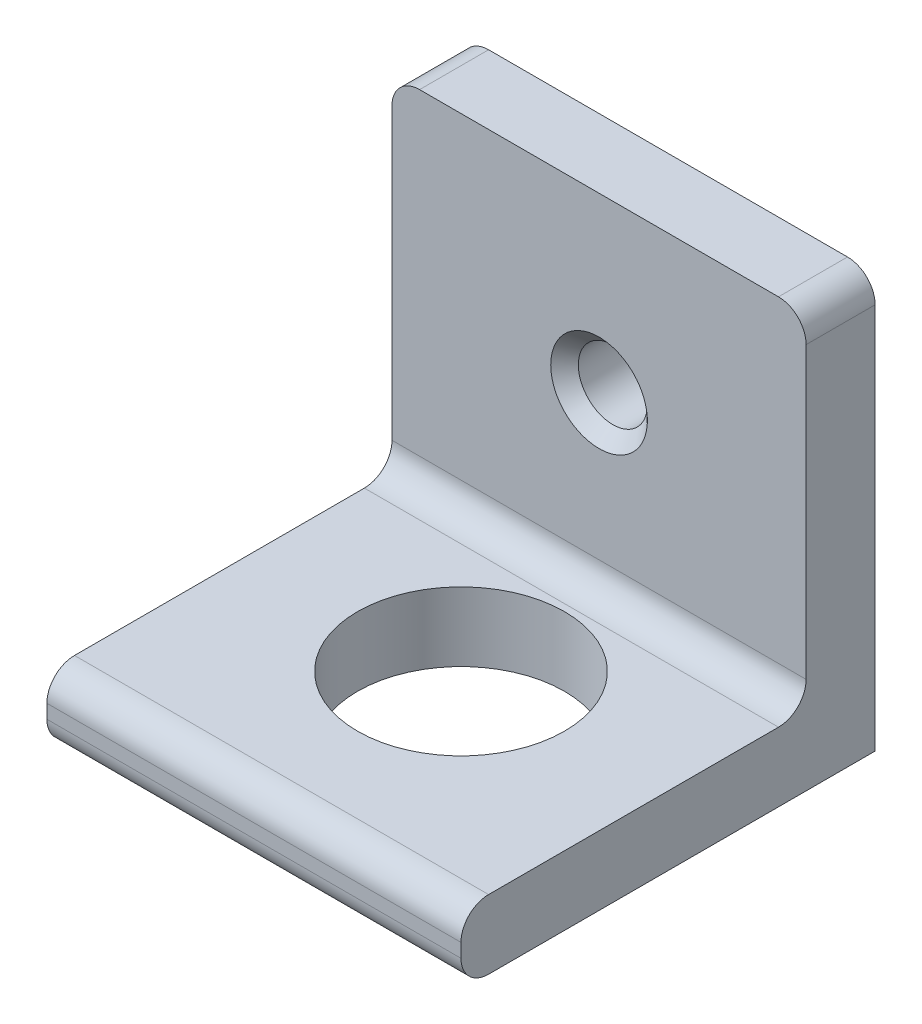
ISO-10303-21;
HEADER;
FILE_DESCRIPTION(('STEP AP214'),'2;1');
FILE_NAME('part.step','',(''),(''),'','','');
FILE_SCHEMA(('AUTOMOTIVE_DESIGN { 1 0 10303 214 1 1 1 1 }'));
ENDSEC;
DATA;
#1=APPLICATION_CONTEXT('core data for automotive mechanical design processes');
#2=APPLICATION_PROTOCOL_DEFINITION('international standard','automotive_design',2000,#1);
#3=PRODUCT_CONTEXT('',#1,'mechanical');
#4=PRODUCT('Part','Part','',(#3));
#5=PRODUCT_RELATED_PRODUCT_CATEGORY('part','',(#4));
#6=PRODUCT_DEFINITION_FORMATION('','',#4);
#7=PRODUCT_DEFINITION_CONTEXT('part definition',#1,'design');
#8=PRODUCT_DEFINITION('design','',#6,#7);
#9=PRODUCT_DEFINITION_SHAPE('','',#8);
#10=(LENGTH_UNIT() NAMED_UNIT(*) SI_UNIT(.MILLI.,.METRE.));
#11=(NAMED_UNIT(*) PLANE_ANGLE_UNIT() SI_UNIT($,.RADIAN.));
#12=(NAMED_UNIT(*) SI_UNIT($,.STERADIAN.) SOLID_ANGLE_UNIT());
#13=UNCERTAINTY_MEASURE_WITH_UNIT(LENGTH_MEASURE(1.E-05),#10,'distance_accuracy_value','');
#14=(GEOMETRIC_REPRESENTATION_CONTEXT(3) GLOBAL_UNCERTAINTY_ASSIGNED_CONTEXT((#13)) GLOBAL_UNIT_ASSIGNED_CONTEXT((#10,
#11,#12)) REPRESENTATION_CONTEXT('',''));
#15=CARTESIAN_POINT('',(0.,0.,0.));
#16=DIRECTION('',(0.,0.,1.));
#17=DIRECTION('',(1.,0.,0.));
#18=AXIS2_PLACEMENT_3D('',#15,#16,#17);
#19=CARTESIAN_POINT('',(0.,5.,0.));
#20=DIRECTION('',(0.,-1.,0.));
#21=DIRECTION('',(0.,0.,-1.));
#22=AXIS2_PLACEMENT_3D('',#19,#20,#21);
#23=PLANE('',#22);
#24=CARTESIAN_POINT('',(82.3088028635692,5.,0.815715524096896));
#25=DIRECTION('',(0.,1.,0.));
#26=DIRECTION('',(0.,0.,-1.));
#27=AXIS2_PLACEMENT_3D('',#24,#25,#26);
#28=CIRCLE('',#27,7.50000000000001);
#29=CARTESIAN_POINT('',(82.3088028635692,5.,-6.68428447590312));
#30=VERTEX_POINT('',#29);
#31=EDGE_CURVE('E163',#30,#30,#28,.T.);
#32=ORIENTED_EDGE('',*,*,#31,.F.);
#33=EDGE_LOOP('',(#32));
#34=FACE_BOUND('',#33,.T.);
#35=DIRECTION('',(0.,0.,-1.));
#36=VECTOR('',#35,1.);
#37=CARTESIAN_POINT('',(67.3088028635692,5.,0.));
#38=LINE('',#37,#36);
#39=CARTESIAN_POINT('',(67.3088028635692,5.,13.8157155240969));
#40=VERTEX_POINT('',#39);
#41=CARTESIAN_POINT('',(67.3088028635692,5.,-7.18428447590311));
#42=VERTEX_POINT('',#41);
#43=EDGE_CURVE('E117',#40,#42,#38,.T.);
#44=ORIENTED_EDGE('',*,*,#43,.F.);
#45=DIRECTION('',(1.,0.,0.));
#46=VECTOR('',#45,1.);
#47=CARTESIAN_POINT('',(0.,5.,13.8157155240969));
#48=LINE('',#47,#46);
#49=CARTESIAN_POINT('',(97.3088028635692,5.,13.8157155240969));
#50=VERTEX_POINT('',#49);
#51=EDGE_CURVE('E183',#40,#50,#48,.T.);
#52=ORIENTED_EDGE('',*,*,#51,.T.);
#53=DIRECTION('',(0.,0.,-1.));
#54=VECTOR('',#53,1.);
#55=CARTESIAN_POINT('',(97.3088028635692,5.,15.8157155240969));
#56=LINE('',#55,#54);
#57=CARTESIAN_POINT('',(97.3088028635692,5.,-7.18428447590311));
#58=VERTEX_POINT('',#57);
#59=EDGE_CURVE('E173',#50,#58,#56,.T.);
#60=ORIENTED_EDGE('',*,*,#59,.T.);
#61=DIRECTION('',(1.,0.,0.));
#62=VECTOR('',#61,1.);
#63=CARTESIAN_POINT('',(-52.6911971364308,5.,-7.1842844759031));
#64=LINE('',#63,#62);
#65=EDGE_CURVE('E181',#58,#42,#64,.F.);
#66=ORIENTED_EDGE('',*,*,#65,.T.);
#67=EDGE_LOOP('',(#44,#52,#60,#66));
#68=FACE_BOUND('',#67,.T.);
#69=ADVANCED_FACE('F33',(#34,#68),#23,.F.);
#70=CARTESIAN_POINT('',(-52.6911971364308,5.,15.8157155240969));
#71=DIRECTION('',(0.,0.,-1.));
#72=DIRECTION('',(-1.,0.,0.));
#73=AXIS2_PLACEMENT_3D('',#70,#71,#72);
#74=PLANE('',#73);
#75=DIRECTION('',(0.,1.,0.));
#76=VECTOR('',#75,1.);
#77=CARTESIAN_POINT('',(67.3088028635692,5.,15.8157155240969));
#78=LINE('',#77,#76);
#79=CARTESIAN_POINT('',(67.3088028635692,2.,15.8157155240969));
#80=VERTEX_POINT('',#79);
#81=CARTESIAN_POINT('',(67.3088028635692,3.,15.8157155240969));
#82=VERTEX_POINT('',#81);
#83=EDGE_CURVE('E223',#80,#82,#78,.T.);
#84=ORIENTED_EDGE('',*,*,#83,.F.);
#85=DIRECTION('',(1.,0.,0.));
#86=VECTOR('',#85,1.);
#87=CARTESIAN_POINT('',(97.3088028635692,2.,15.8157155240969));
#88=LINE('',#87,#86);
#89=CARTESIAN_POINT('',(97.3088028635692,2.,15.8157155240969));
#90=VERTEX_POINT('',#89);
#91=EDGE_CURVE('E243',#80,#90,#88,.T.);
#92=ORIENTED_EDGE('',*,*,#91,.T.);
#93=DIRECTION('',(0.,-1.,0.));
#94=VECTOR('',#93,1.);
#95=CARTESIAN_POINT('',(97.3088028635692,5.,15.8157155240969));
#96=LINE('',#95,#94);
#97=CARTESIAN_POINT('',(97.3088028635692,3.,15.8157155240969));
#98=VERTEX_POINT('',#97);
#99=EDGE_CURVE('E191',#98,#90,#96,.T.);
#100=ORIENTED_EDGE('',*,*,#99,.F.);
#101=DIRECTION('',(1.,0.,0.));
#102=VECTOR('',#101,1.);
#103=CARTESIAN_POINT('',(-52.6911971364308,3.,15.8157155240969));
#104=LINE('',#103,#102);
#105=EDGE_CURVE('E238',#98,#82,#104,.F.);
#106=ORIENTED_EDGE('',*,*,#105,.T.);
#107=EDGE_LOOP('',(#84,#92,#100,#106));
#108=FACE_BOUND('',#107,.T.);
#109=ADVANCED_FACE('F241',(#108),#74,.F.);
#110=CARTESIAN_POINT('',(-52.6911971364308,5.,-14.1842844759031));
#111=DIRECTION('',(0.,0.,1.));
#112=DIRECTION('',(1.,0.,0.));
#113=AXIS2_PLACEMENT_3D('',#110,#111,#112);
#114=PLANE('',#113);
#115=CARTESIAN_POINT('',(82.3088028635692,17.4786642448446,-14.1842844759031));
#116=DIRECTION('',(0.,0.,1.));
#117=DIRECTION('',(1.,0.,0.));
#118=AXIS2_PLACEMENT_3D('',#115,#116,#117);
#119=CIRCLE('',#118,2.50000000000001);
#120=CARTESIAN_POINT('',(84.8088028635692,17.4786642448446,-14.1842844759031));
#121=VERTEX_POINT('',#120);
#122=EDGE_CURVE('E219',#121,#121,#119,.T.);
#123=ORIENTED_EDGE('',*,*,#122,.T.);
#124=EDGE_LOOP('',(#123));
#125=FACE_BOUND('',#124,.T.);
#126=DIRECTION('',(0.,-1.,0.));
#127=VECTOR('',#126,1.);
#128=CARTESIAN_POINT('',(67.3088028635692,5.,-14.1842844759031));
#129=LINE('',#128,#127);
#130=CARTESIAN_POINT('',(67.3088028635692,28.,-14.1842844759031));
#131=VERTEX_POINT('',#130);
#132=CARTESIAN_POINT('',(67.3088028635692,0.,-14.1842844759031));
#133=VERTEX_POINT('',#132);
#134=EDGE_CURVE('E227',#131,#133,#129,.T.);
#135=ORIENTED_EDGE('',*,*,#134,.F.);
#136=CARTESIAN_POINT('',(69.3088028635692,28.,-14.1842844759031));
#137=DIRECTION('',(0.,0.,1.));
#138=DIRECTION('',(1.,0.,0.));
#139=AXIS2_PLACEMENT_3D('',#136,#137,#138);
#140=CIRCLE('',#139,2.);
#141=CARTESIAN_POINT('',(69.3088028635692,30.,-14.1842844759031));
#142=VERTEX_POINT('',#141);
#143=EDGE_CURVE('E11',#131,#142,#140,.F.);
#144=ORIENTED_EDGE('',*,*,#143,.T.);
#145=DIRECTION('',(-1.,0.,0.));
#146=VECTOR('',#145,1.);
#147=CARTESIAN_POINT('',(-52.6911971364308,30.,-14.1842844759031));
#148=LINE('',#147,#146);
#149=CARTESIAN_POINT('',(95.3088028635692,30.,-14.1842844759031));
#150=VERTEX_POINT('',#149);
#151=EDGE_CURVE('E153',#150,#142,#148,.T.);
#152=ORIENTED_EDGE('',*,*,#151,.F.);
#153=CARTESIAN_POINT('',(95.3088028635692,28.,-14.1842844759031));
#154=DIRECTION('',(0.,0.,1.));
#155=DIRECTION('',(1.,0.,0.));
#156=AXIS2_PLACEMENT_3D('',#153,#154,#155);
#157=CIRCLE('',#156,2.);
#158=CARTESIAN_POINT('',(97.3088028635692,28.,-14.1842844759031));
#159=VERTEX_POINT('',#158);
#160=EDGE_CURVE('E136',#150,#159,#157,.F.);
#161=ORIENTED_EDGE('',*,*,#160,.T.);
#162=DIRECTION('',(0.,-1.,0.));
#163=VECTOR('',#162,1.);
#164=CARTESIAN_POINT('',(97.3088028635692,5.,-14.1842844759031));
#165=LINE('',#164,#163);
#166=CARTESIAN_POINT('',(97.3088028635692,0.,-14.1842844759031));
#167=VERTEX_POINT('',#166);
#168=EDGE_CURVE('E177',#159,#167,#165,.T.);
#169=ORIENTED_EDGE('',*,*,#168,.T.);
#170=DIRECTION('',(-1.,0.,0.));
#171=VECTOR('',#170,1.);
#172=CARTESIAN_POINT('',(-52.6911971364308,0.,-14.1842844759031));
#173=LINE('',#172,#171);
#174=EDGE_CURVE('E178',#167,#133,#173,.T.);
#175=ORIENTED_EDGE('',*,*,#174,.T.);
#176=EDGE_LOOP('',(#135,#144,#152,#161,#169,#175));
#177=FACE_BOUND('',#176,.T.);
#178=ADVANCED_FACE('F250',(#125,#177),#114,.F.);
#179=CARTESIAN_POINT('',(0.,0.,0.));
#180=DIRECTION('',(0.,-1.,0.));
#181=DIRECTION('',(0.,0.,-1.));
#182=AXIS2_PLACEMENT_3D('',#179,#180,#181);
#183=PLANE('',#182);
#184=CARTESIAN_POINT('',(82.3088028635692,0.,0.815715524096896));
#185=DIRECTION('',(0.,-1.,0.));
#186=DIRECTION('',(0.,0.,-1.));
#187=AXIS2_PLACEMENT_3D('',#184,#185,#186);
#188=CIRCLE('',#187,7.50000000000001);
#189=CARTESIAN_POINT('',(82.3088028635692,0.,-6.68428447590312));
#190=VERTEX_POINT('',#189);
#191=EDGE_CURVE('E158',#190,#190,#188,.T.);
#192=ORIENTED_EDGE('',*,*,#191,.F.);
#193=EDGE_LOOP('',(#192));
#194=FACE_BOUND('',#193,.T.);
#195=DIRECTION('',(1.,0.,0.));
#196=VECTOR('',#195,1.);
#197=CARTESIAN_POINT('',(-52.6911971364308,0.,13.8157155240969));
#198=LINE('',#197,#196);
#199=CARTESIAN_POINT('',(97.3088028635692,0.,13.8157155240969));
#200=VERTEX_POINT('',#199);
#201=CARTESIAN_POINT('',(67.3088028635692,0.,13.8157155240969));
#202=VERTEX_POINT('',#201);
#203=EDGE_CURVE('E139',#200,#202,#198,.F.);
#204=ORIENTED_EDGE('',*,*,#203,.T.);
#205=DIRECTION('',(0.,0.,-1.));
#206=VECTOR('',#205,1.);
#207=CARTESIAN_POINT('',(67.3088028635692,0.,0.));
#208=LINE('',#207,#206);
#209=EDGE_CURVE('E217',#202,#133,#208,.T.);
#210=ORIENTED_EDGE('',*,*,#209,.T.);
#211=ORIENTED_EDGE('',*,*,#174,.F.);
#212=DIRECTION('',(0.,0.,-1.));
#213=VECTOR('',#212,1.);
#214=CARTESIAN_POINT('',(97.3088028635692,0.,15.8157155240969));
#215=LINE('',#214,#213);
#216=EDGE_CURVE('E170',#200,#167,#215,.T.);
#217=ORIENTED_EDGE('',*,*,#216,.F.);
#218=EDGE_LOOP('',(#204,#210,#211,#217));
#219=FACE_BOUND('',#218,.T.);
#220=ADVANCED_FACE('F216',(#194,#219),#183,.T.);
#221=CARTESIAN_POINT('',(-52.6911971364308,30.,-9.1842844759031));
#222=DIRECTION('',(0.,0.,-1.));
#223=DIRECTION('',(-1.,0.,0.));
#224=AXIS2_PLACEMENT_3D('',#221,#222,#223);
#225=PLANE('',#224);
#226=CARTESIAN_POINT('',(82.3088028635692,17.4786642448446,-9.18428447590311));
#227=DIRECTION('',(0.,0.,-1.));
#228=DIRECTION('',(-1.,0.,0.));
#229=AXIS2_PLACEMENT_3D('',#226,#227,#228);
#230=CIRCLE('',#229,3.50000000000006);
#231=CARTESIAN_POINT('',(78.8088028635691,17.4786642448446,-9.18428447590311));
#232=VERTEX_POINT('',#231);
#233=EDGE_CURVE('E193',#232,#232,#230,.T.);
#234=ORIENTED_EDGE('',*,*,#233,.T.);
#235=EDGE_LOOP('',(#234));
#236=FACE_BOUND('',#235,.T.);
#237=DIRECTION('',(1.,0.,0.));
#238=VECTOR('',#237,1.);
#239=CARTESIAN_POINT('',(-52.6911971364308,30.,-9.1842844759031));
#240=LINE('',#239,#238);
#241=CARTESIAN_POINT('',(69.3088028635692,30.,-9.18428447590311));
#242=VERTEX_POINT('',#241);
#243=CARTESIAN_POINT('',(95.3088028635692,30.,-9.18428447590311));
#244=VERTEX_POINT('',#243);
#245=EDGE_CURVE('E151',#242,#244,#240,.T.);
#246=ORIENTED_EDGE('',*,*,#245,.F.);
#247=CARTESIAN_POINT('',(69.3088028635692,28.,-9.18428447590311));
#248=DIRECTION('',(0.,0.,-1.));
#249=DIRECTION('',(-1.,0.,0.));
#250=AXIS2_PLACEMENT_3D('',#247,#248,#249);
#251=CIRCLE('',#250,2.);
#252=CARTESIAN_POINT('',(67.3088028635692,28.,-9.18428447590311));
#253=VERTEX_POINT('',#252);
#254=EDGE_CURVE('E55',#242,#253,#251,.F.);
#255=ORIENTED_EDGE('',*,*,#254,.T.);
#256=DIRECTION('',(0.,1.,0.));
#257=VECTOR('',#256,1.);
#258=CARTESIAN_POINT('',(67.3088028635692,30.,-9.18428447590311));
#259=LINE('',#258,#257);
#260=CARTESIAN_POINT('',(67.3088028635692,7.,-9.18428447590311));
#261=VERTEX_POINT('',#260);
#262=EDGE_CURVE('E115',#261,#253,#259,.T.);
#263=ORIENTED_EDGE('',*,*,#262,.F.);
#264=DIRECTION('',(1.,0.,0.));
#265=VECTOR('',#264,1.);
#266=CARTESIAN_POINT('',(97.3088028635692,7.,-9.18428447590311));
#267=LINE('',#266,#265);
#268=CARTESIAN_POINT('',(97.3088028635692,7.,-9.18428447590311));
#269=VERTEX_POINT('',#268);
#270=EDGE_CURVE('E127',#261,#269,#267,.T.);
#271=ORIENTED_EDGE('',*,*,#270,.T.);
#272=DIRECTION('',(0.,-1.,0.));
#273=VECTOR('',#272,1.);
#274=CARTESIAN_POINT('',(97.3088028635692,30.,-9.18428447590311));
#275=LINE('',#274,#273);
#276=CARTESIAN_POINT('',(97.3088028635692,28.,-9.18428447590311));
#277=VERTEX_POINT('',#276);
#278=EDGE_CURVE('E160',#277,#269,#275,.T.);
#279=ORIENTED_EDGE('',*,*,#278,.F.);
#280=CARTESIAN_POINT('',(95.3088028635692,28.,-9.18428447590311));
#281=DIRECTION('',(0.,0.,-1.));
#282=DIRECTION('',(-1.,0.,0.));
#283=AXIS2_PLACEMENT_3D('',#280,#281,#282);
#284=CIRCLE('',#283,2.);
#285=EDGE_CURVE('E133',#277,#244,#284,.F.);
#286=ORIENTED_EDGE('',*,*,#285,.T.);
#287=EDGE_LOOP('',(#246,#255,#263,#271,#279,#286));
#288=FACE_BOUND('',#287,.T.);
#289=ADVANCED_FACE('F125',(#236,#288),#225,.F.);
#290=CARTESIAN_POINT('',(0.,30.,0.));
#291=DIRECTION('',(0.,1.,0.));
#292=DIRECTION('',(0.,0.,1.));
#293=AXIS2_PLACEMENT_3D('',#290,#291,#292);
#294=PLANE('',#293);
#295=ORIENTED_EDGE('',*,*,#151,.T.);
#296=DIRECTION('',(0.,0.,1.));
#297=VECTOR('',#296,1.);
#298=CARTESIAN_POINT('',(69.3088028635692,30.,0.));
#299=LINE('',#298,#297);
#300=EDGE_CURVE('E122',#142,#242,#299,.T.);
#301=ORIENTED_EDGE('',*,*,#300,.T.);
#302=ORIENTED_EDGE('',*,*,#245,.T.);
#303=DIRECTION('',(0.,0.,-1.));
#304=VECTOR('',#303,1.);
#305=CARTESIAN_POINT('',(95.3088028635692,30.,-14.1842844759031));
#306=LINE('',#305,#304);
#307=EDGE_CURVE('E132',#244,#150,#306,.T.);
#308=ORIENTED_EDGE('',*,*,#307,.T.);
#309=EDGE_LOOP('',(#295,#301,#302,#308));
#310=FACE_BOUND('',#309,.T.);
#311=ADVANCED_FACE('F150',(#310),#294,.T.);
#312=CARTESIAN_POINT('',(0.,3.,13.8157155240969));
#313=DIRECTION('',(1.,0.,0.));
#314=DIRECTION('',(0.,0.,-1.));
#315=AXIS2_PLACEMENT_3D('',#312,#313,#314);
#316=CYLINDRICAL_SURFACE('',#315,2.);
#317=ORIENTED_EDGE('',*,*,#51,.F.);
#318=CARTESIAN_POINT('',(67.3088028635692,3.,13.8157155240969));
#319=DIRECTION('',(-1.,0.,0.));
#320=DIRECTION('',(0.,0.,1.));
#321=AXIS2_PLACEMENT_3D('',#318,#319,#320);
#322=CIRCLE('',#321,2.);
#323=EDGE_CURVE('E229',#40,#82,#322,.F.);
#324=ORIENTED_EDGE('',*,*,#323,.T.);
#325=ORIENTED_EDGE('',*,*,#105,.F.);
#326=CARTESIAN_POINT('',(97.3088028635692,3.,13.8157155240969));
#327=DIRECTION('',(-1.,0.,0.));
#328=DIRECTION('',(0.,0.,1.));
#329=AXIS2_PLACEMENT_3D('',#326,#327,#328);
#330=CIRCLE('',#329,2.);
#331=EDGE_CURVE('E245',#50,#98,#330,.F.);
#332=ORIENTED_EDGE('',*,*,#331,.F.);
#333=EDGE_LOOP('',(#317,#324,#325,#332));
#334=FACE_BOUND('',#333,.T.);
#335=ADVANCED_FACE('F236',(#334),#316,.T.);
#336=CARTESIAN_POINT('',(-52.6911971364308,2.,13.8157155240969));
#337=DIRECTION('',(-1.,0.,0.));
#338=DIRECTION('',(0.,0.,1.));
#339=AXIS2_PLACEMENT_3D('',#336,#337,#338);
#340=CYLINDRICAL_SURFACE('',#339,2.);
#341=ORIENTED_EDGE('',*,*,#91,.F.);
#342=CARTESIAN_POINT('',(67.3088028635692,2.,13.8157155240969));
#343=DIRECTION('',(-1.,0.,0.));
#344=DIRECTION('',(0.,0.,1.));
#345=AXIS2_PLACEMENT_3D('',#342,#343,#344);
#346=CIRCLE('',#345,2.);
#347=EDGE_CURVE('E220',#80,#202,#346,.F.);
#348=ORIENTED_EDGE('',*,*,#347,.T.);
#349=ORIENTED_EDGE('',*,*,#203,.F.);
#350=CARTESIAN_POINT('',(97.3088028635692,2.,13.8157155240969));
#351=DIRECTION('',(-1.,0.,0.));
#352=DIRECTION('',(0.,0.,1.));
#353=AXIS2_PLACEMENT_3D('',#350,#351,#352);
#354=CIRCLE('',#353,2.);
#355=EDGE_CURVE('E211',#90,#200,#354,.F.);
#356=ORIENTED_EDGE('',*,*,#355,.F.);
#357=EDGE_LOOP('',(#341,#348,#349,#356));
#358=FACE_BOUND('',#357,.T.);
#359=ADVANCED_FACE('F284',(#358),#340,.T.);
#360=CARTESIAN_POINT('',(-52.6911971364308,7.,-7.1842844759031));
#361=DIRECTION('',(-1.,0.,0.));
#362=DIRECTION('',(0.,0.,1.));
#363=AXIS2_PLACEMENT_3D('',#360,#361,#362);
#364=CYLINDRICAL_SURFACE('',#363,2.);
#365=CARTESIAN_POINT('',(67.3088028635692,7.,-7.18428447590311));
#366=DIRECTION('',(-1.,0.,0.));
#367=DIRECTION('',(0.,0.,1.));
#368=AXIS2_PLACEMENT_3D('',#365,#366,#367);
#369=CIRCLE('',#368,2.);
#370=EDGE_CURVE('E113',#42,#261,#369,.F.);
#371=ORIENTED_EDGE('',*,*,#370,.F.);
#372=ORIENTED_EDGE('',*,*,#65,.F.);
#373=CARTESIAN_POINT('',(97.3088028635692,7.,-7.18428447590311));
#374=DIRECTION('',(-1.,0.,0.));
#375=DIRECTION('',(0.,0.,1.));
#376=AXIS2_PLACEMENT_3D('',#373,#374,#375);
#377=CIRCLE('',#376,2.);
#378=EDGE_CURVE('E123',#269,#58,#377,.T.);
#379=ORIENTED_EDGE('',*,*,#378,.F.);
#380=ORIENTED_EDGE('',*,*,#270,.F.);
#381=EDGE_LOOP('',(#371,#372,#379,#380));
#382=FACE_BOUND('',#381,.T.);
#383=ADVANCED_FACE('F130',(#382),#364,.F.);
#384=CARTESIAN_POINT('',(97.3088028635692,5.,15.8157155240969));
#385=DIRECTION('',(-1.,0.,0.));
#386=DIRECTION('',(0.,0.,1.));
#387=AXIS2_PLACEMENT_3D('',#384,#385,#386);
#388=PLANE('',#387);
#389=ORIENTED_EDGE('',*,*,#59,.F.);
#390=ORIENTED_EDGE('',*,*,#331,.T.);
#391=ORIENTED_EDGE('',*,*,#99,.T.);
#392=ORIENTED_EDGE('',*,*,#355,.T.);
#393=ORIENTED_EDGE('',*,*,#216,.T.);
#394=ORIENTED_EDGE('',*,*,#168,.F.);
#395=DIRECTION('',(0.,0.,-1.));
#396=VECTOR('',#395,1.);
#397=CARTESIAN_POINT('',(97.3088028635692,28.,-9.18428447590311));
#398=LINE('',#397,#396);
#399=EDGE_CURVE('E185',#159,#277,#398,.F.);
#400=ORIENTED_EDGE('',*,*,#399,.T.);
#401=ORIENTED_EDGE('',*,*,#278,.T.);
#402=ORIENTED_EDGE('',*,*,#378,.T.);
#403=EDGE_LOOP('',(#389,#390,#391,#392,#393,#394,#400,#401,#402));
#404=FACE_BOUND('',#403,.T.);
#405=ADVANCED_FACE('F208',(#404),#388,.F.);
#406=CARTESIAN_POINT('',(82.3088028635692,-20.,0.815715524096896));
#407=DIRECTION('',(0.,1.,0.));
#408=DIRECTION('',(0.,0.,1.));
#409=AXIS2_PLACEMENT_3D('',#406,#407,#408);
#410=CYLINDRICAL_SURFACE('',#409,7.50000000000001);
#411=ORIENTED_EDGE('',*,*,#191,.T.);
#412=EDGE_LOOP('',(#411));
#413=FACE_BOUND('',#412,.T.);
#414=ORIENTED_EDGE('',*,*,#31,.T.);
#415=EDGE_LOOP('',(#414));
#416=FACE_BOUND('',#415,.T.);
#417=ADVANCED_FACE('F275',(#413,#416),#410,.F.);
#418=CARTESIAN_POINT('',(82.3088028635692,17.4786642448446,-34.1842844759031));
#419=DIRECTION('',(0.,0.,1.));
#420=DIRECTION('',(1.,0.,0.));
#421=AXIS2_PLACEMENT_3D('',#418,#419,#420);
#422=CYLINDRICAL_SURFACE('',#421,2.50000000000001);
#423=CARTESIAN_POINT('',(82.3088028635692,17.4786642448446,-10.1842844759031));
#424=DIRECTION('',(0.,0.,-1.));
#425=DIRECTION('',(-1.,0.,0.));
#426=AXIS2_PLACEMENT_3D('',#423,#424,#425);
#427=CIRCLE('',#426,2.50000000000001);
#428=CARTESIAN_POINT('',(79.8088028635692,17.4786642448446,-10.1842844759031));
#429=VERTEX_POINT('',#428);
#430=EDGE_CURVE('E179',#429,#429,#427,.F.);
#431=ORIENTED_EDGE('',*,*,#430,.T.);
#432=EDGE_LOOP('',(#431));
#433=FACE_BOUND('',#432,.T.);
#434=ORIENTED_EDGE('',*,*,#122,.F.);
#435=EDGE_LOOP('',(#434));
#436=FACE_BOUND('',#435,.T.);
#437=ADVANCED_FACE('F280',(#433,#436),#422,.F.);
#438=CARTESIAN_POINT('',(82.3088028635692,17.4786642448446,-10.1842844759031));
#439=DIRECTION('',(0.,0.,1.));
#440=DIRECTION('',(1.,0.,0.));
#441=AXIS2_PLACEMENT_3D('',#438,#439,#440);
#442=CONICAL_SURFACE('',#441,2.50000000000001,0.785398163397458);
#443=ORIENTED_EDGE('',*,*,#233,.F.);
#444=EDGE_LOOP('',(#443));
#445=FACE_BOUND('',#444,.T.);
#446=ORIENTED_EDGE('',*,*,#430,.F.);
#447=EDGE_LOOP('',(#446));
#448=FACE_BOUND('',#447,.T.);
#449=ADVANCED_FACE('F277',(#445,#448),#442,.F.);
#450=CARTESIAN_POINT('',(95.3088028635692,28.,0.));
#451=DIRECTION('',(0.,0.,1.));
#452=DIRECTION('',(1.,0.,0.));
#453=AXIS2_PLACEMENT_3D('',#450,#451,#452);
#454=CYLINDRICAL_SURFACE('',#453,2.);
#455=ORIENTED_EDGE('',*,*,#285,.F.);
#456=ORIENTED_EDGE('',*,*,#399,.F.);
#457=ORIENTED_EDGE('',*,*,#160,.F.);
#458=ORIENTED_EDGE('',*,*,#307,.F.);
#459=EDGE_LOOP('',(#455,#456,#457,#458));
#460=FACE_BOUND('',#459,.T.);
#461=ADVANCED_FACE('F249',(#460),#454,.T.);
#462=CARTESIAN_POINT('',(67.3088028635692,0.,0.));
#463=DIRECTION('',(-1.,0.,0.));
#464=DIRECTION('',(0.,0.,1.));
#465=AXIS2_PLACEMENT_3D('',#462,#463,#464);
#466=PLANE('',#465);
#467=ORIENTED_EDGE('',*,*,#262,.T.);
#468=DIRECTION('',(0.,0.,1.));
#469=VECTOR('',#468,1.);
#470=CARTESIAN_POINT('',(67.3088028635692,28.,0.));
#471=LINE('',#470,#469);
#472=EDGE_CURVE('E41',#253,#131,#471,.F.);
#473=ORIENTED_EDGE('',*,*,#472,.T.);
#474=ORIENTED_EDGE('',*,*,#134,.T.);
#475=ORIENTED_EDGE('',*,*,#209,.F.);
#476=ORIENTED_EDGE('',*,*,#347,.F.);
#477=ORIENTED_EDGE('',*,*,#83,.T.);
#478=ORIENTED_EDGE('',*,*,#323,.F.);
#479=ORIENTED_EDGE('',*,*,#43,.T.);
#480=ORIENTED_EDGE('',*,*,#370,.T.);
#481=EDGE_LOOP('',(#467,#473,#474,#475,#476,#477,#478,#479,#480));
#482=FACE_BOUND('',#481,.T.);
#483=ADVANCED_FACE('F114',(#482),#466,.T.);
#484=CARTESIAN_POINT('',(69.3088028635692,28.,0.));
#485=DIRECTION('',(0.,0.,1.));
#486=DIRECTION('',(1.,0.,0.));
#487=AXIS2_PLACEMENT_3D('',#484,#485,#486);
#488=CYLINDRICAL_SURFACE('',#487,2.);
#489=ORIENTED_EDGE('',*,*,#143,.F.);
#490=ORIENTED_EDGE('',*,*,#472,.F.);
#491=ORIENTED_EDGE('',*,*,#254,.F.);
#492=ORIENTED_EDGE('',*,*,#300,.F.);
#493=EDGE_LOOP('',(#489,#490,#491,#492));
#494=FACE_BOUND('',#493,.T.);
#495=ADVANCED_FACE('F35',(#494),#488,.T.);
#496=CLOSED_SHELL('',(#69,#109,#178,#220,#289,#311,#335,#359,#383,#405,#417,#437,#449,#461,#483,#495));
#497=MANIFOLD_SOLID_BREP('B2',#496);
#498=ADVANCED_BREP_SHAPE_REPRESENTATION('',(#18,#497),#14);
#499=SHAPE_DEFINITION_REPRESENTATION(#9,#498);
ENDSEC;
END-ISO-10303-21;
